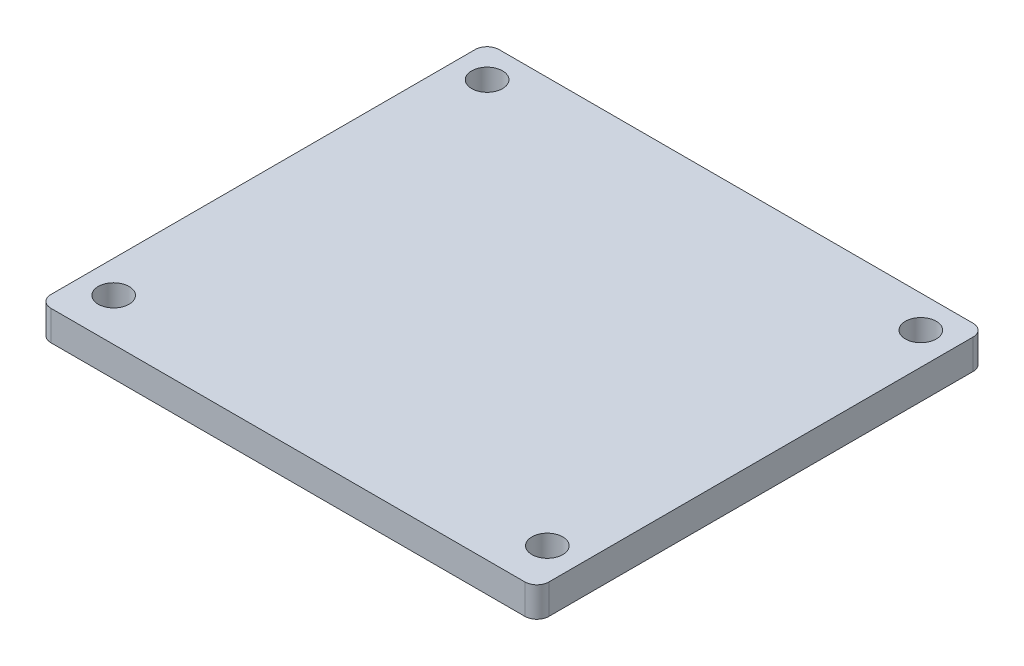
ISO-10303-21;
HEADER;
FILE_DESCRIPTION(('STEP AP214'),'2;1');
FILE_NAME('part.step','',(''),(''),'','','');
FILE_SCHEMA(('AUTOMOTIVE_DESIGN { 1 0 10303 214 1 1 1 1 }'));
ENDSEC;
DATA;
#1=APPLICATION_CONTEXT('core data for automotive mechanical design processes');
#2=APPLICATION_PROTOCOL_DEFINITION('international standard','automotive_design',2000,#1);
#3=PRODUCT_CONTEXT('',#1,'mechanical');
#4=PRODUCT('Part','Part','',(#3));
#5=PRODUCT_RELATED_PRODUCT_CATEGORY('part','',(#4));
#6=PRODUCT_DEFINITION_FORMATION('','',#4);
#7=PRODUCT_DEFINITION_CONTEXT('part definition',#1,'design');
#8=PRODUCT_DEFINITION('design','',#6,#7);
#9=PRODUCT_DEFINITION_SHAPE('','',#8);
#10=(LENGTH_UNIT() NAMED_UNIT(*) SI_UNIT(.MILLI.,.METRE.));
#11=(NAMED_UNIT(*) PLANE_ANGLE_UNIT() SI_UNIT($,.RADIAN.));
#12=(NAMED_UNIT(*) SI_UNIT($,.STERADIAN.) SOLID_ANGLE_UNIT());
#13=UNCERTAINTY_MEASURE_WITH_UNIT(LENGTH_MEASURE(1.E-05),#10,'distance_accuracy_value','');
#14=(GEOMETRIC_REPRESENTATION_CONTEXT(3) GLOBAL_UNCERTAINTY_ASSIGNED_CONTEXT((#13)) GLOBAL_UNIT_ASSIGNED_CONTEXT((#10,
#11,#12)) REPRESENTATION_CONTEXT('',''));
#15=CARTESIAN_POINT('',(0.,0.,0.));
#16=DIRECTION('',(0.,0.,1.));
#17=DIRECTION('',(1.,0.,0.));
#18=AXIS2_PLACEMENT_3D('',#15,#16,#17);
#19=CARTESIAN_POINT('',(-23.8,3.,21.3));
#20=DIRECTION('',(0.,-1.,0.));
#21=DIRECTION('',(0.,0.,-1.));
#22=AXIS2_PLACEMENT_3D('',#19,#20,#21);
#23=PLANE('',#22);
#24=CARTESIAN_POINT('',(-23.8,3.,21.3));
#25=DIRECTION('',(0.,1.,0.));
#26=DIRECTION('',(0.,0.,-1.));
#27=AXIS2_PLACEMENT_3D('',#24,#25,#26);
#28=CIRCLE('',#27,1.2);
#29=CARTESIAN_POINT('',(-25.,3.,21.3));
#30=VERTEX_POINT('',#29);
#31=CARTESIAN_POINT('',(-23.8,3.,22.5));
#32=VERTEX_POINT('',#31);
#33=EDGE_CURVE('E145',#30,#32,#28,.T.);
#34=ORIENTED_EDGE('',*,*,#33,.T.);
#35=DIRECTION('',(1.,0.,0.));
#36=VECTOR('',#35,1.);
#37=CARTESIAN_POINT('',(-23.8,3.,22.5));
#38=LINE('',#37,#36);
#39=CARTESIAN_POINT('',(23.8,3.,22.5));
#40=VERTEX_POINT('',#39);
#41=EDGE_CURVE('E93',#32,#40,#38,.T.);
#42=ORIENTED_EDGE('',*,*,#41,.T.);
#43=CARTESIAN_POINT('',(23.8,3.,21.3));
#44=DIRECTION('',(0.,1.,0.));
#45=DIRECTION('',(0.,0.,1.));
#46=AXIS2_PLACEMENT_3D('',#43,#44,#45);
#47=CIRCLE('',#46,1.2);
#48=CARTESIAN_POINT('',(25.,3.,21.3));
#49=VERTEX_POINT('',#48);
#50=EDGE_CURVE('E160',#40,#49,#47,.T.);
#51=ORIENTED_EDGE('',*,*,#50,.T.);
#52=DIRECTION('',(0.,0.,-1.));
#53=VECTOR('',#52,1.);
#54=CARTESIAN_POINT('',(25.,3.,21.3));
#55=LINE('',#54,#53);
#56=CARTESIAN_POINT('',(25.,3.,-21.3));
#57=VERTEX_POINT('',#56);
#58=EDGE_CURVE('E173',#49,#57,#55,.T.);
#59=ORIENTED_EDGE('',*,*,#58,.T.);
#60=CARTESIAN_POINT('',(23.8,3.,-21.3));
#61=DIRECTION('',(0.,1.,0.));
#62=DIRECTION('',(0.,0.,-1.));
#63=AXIS2_PLACEMENT_3D('',#60,#61,#62);
#64=CIRCLE('',#63,1.2);
#65=CARTESIAN_POINT('',(23.8,3.,-22.5));
#66=VERTEX_POINT('',#65);
#67=EDGE_CURVE('E112',#57,#66,#64,.T.);
#68=ORIENTED_EDGE('',*,*,#67,.T.);
#69=DIRECTION('',(-1.,0.,0.));
#70=VECTOR('',#69,1.);
#71=CARTESIAN_POINT('',(-23.8,3.,-22.5));
#72=LINE('',#71,#70);
#73=CARTESIAN_POINT('',(-23.8,3.,-22.5));
#74=VERTEX_POINT('',#73);
#75=EDGE_CURVE('E106',#66,#74,#72,.T.);
#76=ORIENTED_EDGE('',*,*,#75,.T.);
#77=CARTESIAN_POINT('',(-23.8,3.,-21.3));
#78=DIRECTION('',(0.,1.,0.));
#79=DIRECTION('',(0.,0.,-1.));
#80=AXIS2_PLACEMENT_3D('',#77,#78,#79);
#81=CIRCLE('',#80,1.2);
#82=CARTESIAN_POINT('',(-25.,3.,-21.3));
#83=VERTEX_POINT('',#82);
#84=EDGE_CURVE('E110',#74,#83,#81,.T.);
#85=ORIENTED_EDGE('',*,*,#84,.T.);
#86=DIRECTION('',(0.,0.,1.));
#87=VECTOR('',#86,1.);
#88=CARTESIAN_POINT('',(-25.,3.,21.3));
#89=LINE('',#88,#87);
#90=EDGE_CURVE('E50',#83,#30,#89,.T.);
#91=ORIENTED_EDGE('',*,*,#90,.T.);
#92=EDGE_LOOP('',(#34,#42,#51,#59,#68,#76,#85,#91));
#93=FACE_BOUND('',#92,.T.);
#94=CARTESIAN_POINT('',(-21.775,3.,-19.275));
#95=DIRECTION('',(0.,1.,0.));
#96=DIRECTION('',(0.,0.,1.));
#97=AXIS2_PLACEMENT_3D('',#94,#95,#96);
#98=CIRCLE('',#97,1.55);
#99=CARTESIAN_POINT('',(-21.775,3.,-17.725));
#100=VERTEX_POINT('',#99);
#101=EDGE_CURVE('E134',#100,#100,#98,.T.);
#102=ORIENTED_EDGE('',*,*,#101,.F.);
#103=EDGE_LOOP('',(#102));
#104=FACE_BOUND('',#103,.T.);
#105=CARTESIAN_POINT('',(21.775,3.,-19.275));
#106=DIRECTION('',(0.,1.,0.));
#107=DIRECTION('',(0.,0.,1.));
#108=AXIS2_PLACEMENT_3D('',#105,#106,#107);
#109=CIRCLE('',#108,1.55);
#110=CARTESIAN_POINT('',(21.775,3.,-17.725));
#111=VERTEX_POINT('',#110);
#112=EDGE_CURVE('E182',#111,#111,#109,.T.);
#113=ORIENTED_EDGE('',*,*,#112,.F.);
#114=EDGE_LOOP('',(#113));
#115=FACE_BOUND('',#114,.T.);
#116=CARTESIAN_POINT('',(21.775,3.,18.225));
#117=DIRECTION('',(0.,1.,0.));
#118=DIRECTION('',(0.,0.,1.));
#119=AXIS2_PLACEMENT_3D('',#116,#117,#118);
#120=CIRCLE('',#119,1.55);
#121=CARTESIAN_POINT('',(21.775,3.,19.775));
#122=VERTEX_POINT('',#121);
#123=EDGE_CURVE('E188',#122,#122,#120,.T.);
#124=ORIENTED_EDGE('',*,*,#123,.F.);
#125=EDGE_LOOP('',(#124));
#126=FACE_BOUND('',#125,.T.);
#127=CARTESIAN_POINT('',(-21.775,3.,18.225));
#128=DIRECTION('',(0.,1.,0.));
#129=DIRECTION('',(0.,0.,1.));
#130=AXIS2_PLACEMENT_3D('',#127,#128,#129);
#131=CIRCLE('',#130,1.55);
#132=CARTESIAN_POINT('',(-21.775,3.,19.775));
#133=VERTEX_POINT('',#132);
#134=EDGE_CURVE('E194',#133,#133,#131,.T.);
#135=ORIENTED_EDGE('',*,*,#134,.F.);
#136=EDGE_LOOP('',(#135));
#137=FACE_BOUND('',#136,.T.);
#138=ADVANCED_FACE('F33',(#93,#104,#115,#126,#137),#23,.F.);
#139=CARTESIAN_POINT('',(-23.8,0.,21.3));
#140=DIRECTION('',(0.,-1.,0.));
#141=DIRECTION('',(0.,0.,-1.));
#142=AXIS2_PLACEMENT_3D('',#139,#140,#141);
#143=PLANE('',#142);
#144=CARTESIAN_POINT('',(21.775,0.,18.225));
#145=DIRECTION('',(0.,1.,0.));
#146=DIRECTION('',(0.,0.,1.));
#147=AXIS2_PLACEMENT_3D('',#144,#145,#146);
#148=CIRCLE('',#147,1.55);
#149=CARTESIAN_POINT('',(21.775,0.,19.775));
#150=VERTEX_POINT('',#149);
#151=EDGE_CURVE('E191',#150,#150,#148,.T.);
#152=ORIENTED_EDGE('',*,*,#151,.T.);
#153=EDGE_LOOP('',(#152));
#154=FACE_BOUND('',#153,.T.);
#155=CARTESIAN_POINT('',(-21.775,0.,-19.275));
#156=DIRECTION('',(0.,1.,0.));
#157=DIRECTION('',(0.,0.,1.));
#158=AXIS2_PLACEMENT_3D('',#155,#156,#157);
#159=CIRCLE('',#158,1.55);
#160=CARTESIAN_POINT('',(-21.775,0.,-17.725));
#161=VERTEX_POINT('',#160);
#162=EDGE_CURVE('E179',#161,#161,#159,.T.);
#163=ORIENTED_EDGE('',*,*,#162,.T.);
#164=EDGE_LOOP('',(#163));
#165=FACE_BOUND('',#164,.T.);
#166=CARTESIAN_POINT('',(-23.8,0.,21.3));
#167=DIRECTION('',(0.,1.,0.));
#168=DIRECTION('',(0.,0.,-1.));
#169=AXIS2_PLACEMENT_3D('',#166,#167,#168);
#170=CIRCLE('',#169,1.2);
#171=CARTESIAN_POINT('',(-25.,0.,21.3));
#172=VERTEX_POINT('',#171);
#173=CARTESIAN_POINT('',(-23.8,0.,22.5));
#174=VERTEX_POINT('',#173);
#175=EDGE_CURVE('E130',#172,#174,#170,.T.);
#176=ORIENTED_EDGE('',*,*,#175,.F.);
#177=DIRECTION('',(0.,0.,1.));
#178=VECTOR('',#177,1.);
#179=CARTESIAN_POINT('',(-25.,0.,21.3));
#180=LINE('',#179,#178);
#181=CARTESIAN_POINT('',(-25.,0.,-21.3));
#182=VERTEX_POINT('',#181);
#183=EDGE_CURVE('E85',#182,#172,#180,.T.);
#184=ORIENTED_EDGE('',*,*,#183,.F.);
#185=CARTESIAN_POINT('',(-23.8,0.,-21.3));
#186=DIRECTION('',(0.,1.,0.));
#187=DIRECTION('',(0.,0.,-1.));
#188=AXIS2_PLACEMENT_3D('',#185,#186,#187);
#189=CIRCLE('',#188,1.2);
#190=CARTESIAN_POINT('',(-23.8,0.,-22.5));
#191=VERTEX_POINT('',#190);
#192=EDGE_CURVE('E79',#191,#182,#189,.T.);
#193=ORIENTED_EDGE('',*,*,#192,.F.);
#194=DIRECTION('',(-1.,0.,0.));
#195=VECTOR('',#194,1.);
#196=CARTESIAN_POINT('',(-23.8,0.,-22.5));
#197=LINE('',#196,#195);
#198=CARTESIAN_POINT('',(23.8,0.,-22.5));
#199=VERTEX_POINT('',#198);
#200=EDGE_CURVE('E120',#199,#191,#197,.T.);
#201=ORIENTED_EDGE('',*,*,#200,.F.);
#202=CARTESIAN_POINT('',(23.8,0.,-21.3));
#203=DIRECTION('',(0.,1.,0.));
#204=DIRECTION('',(0.,0.,-1.));
#205=AXIS2_PLACEMENT_3D('',#202,#203,#204);
#206=CIRCLE('',#205,1.2);
#207=CARTESIAN_POINT('',(25.,0.,-21.3));
#208=VERTEX_POINT('',#207);
#209=EDGE_CURVE('E140',#208,#199,#206,.T.);
#210=ORIENTED_EDGE('',*,*,#209,.F.);
#211=DIRECTION('',(0.,0.,-1.));
#212=VECTOR('',#211,1.);
#213=CARTESIAN_POINT('',(25.,0.,21.3));
#214=LINE('',#213,#212);
#215=CARTESIAN_POINT('',(25.,0.,21.3));
#216=VERTEX_POINT('',#215);
#217=EDGE_CURVE('E138',#216,#208,#214,.T.);
#218=ORIENTED_EDGE('',*,*,#217,.F.);
#219=CARTESIAN_POINT('',(23.8,0.,21.3));
#220=DIRECTION('',(0.,1.,0.));
#221=DIRECTION('',(0.,0.,1.));
#222=AXIS2_PLACEMENT_3D('',#219,#220,#221);
#223=CIRCLE('',#222,1.2);
#224=CARTESIAN_POINT('',(23.8,0.,22.5));
#225=VERTEX_POINT('',#224);
#226=EDGE_CURVE('E136',#225,#216,#223,.T.);
#227=ORIENTED_EDGE('',*,*,#226,.F.);
#228=DIRECTION('',(1.,0.,0.));
#229=VECTOR('',#228,1.);
#230=CARTESIAN_POINT('',(-23.8,0.,22.5));
#231=LINE('',#230,#229);
#232=EDGE_CURVE('E133',#174,#225,#231,.T.);
#233=ORIENTED_EDGE('',*,*,#232,.F.);
#234=EDGE_LOOP('',(#176,#184,#193,#201,#210,#218,#227,#233));
#235=FACE_BOUND('',#234,.T.);
#236=CARTESIAN_POINT('',(21.775,0.,-19.275));
#237=DIRECTION('',(0.,1.,0.));
#238=DIRECTION('',(0.,0.,1.));
#239=AXIS2_PLACEMENT_3D('',#236,#237,#238);
#240=CIRCLE('',#239,1.55);
#241=CARTESIAN_POINT('',(21.775,0.,-17.725));
#242=VERTEX_POINT('',#241);
#243=EDGE_CURVE('E185',#242,#242,#240,.T.);
#244=ORIENTED_EDGE('',*,*,#243,.T.);
#245=EDGE_LOOP('',(#244));
#246=FACE_BOUND('',#245,.T.);
#247=CARTESIAN_POINT('',(-21.775,0.,18.225));
#248=DIRECTION('',(0.,1.,0.));
#249=DIRECTION('',(0.,0.,1.));
#250=AXIS2_PLACEMENT_3D('',#247,#248,#249);
#251=CIRCLE('',#250,1.55);
#252=CARTESIAN_POINT('',(-21.775,0.,19.775));
#253=VERTEX_POINT('',#252);
#254=EDGE_CURVE('E197',#253,#253,#251,.T.);
#255=ORIENTED_EDGE('',*,*,#254,.T.);
#256=EDGE_LOOP('',(#255));
#257=FACE_BOUND('',#256,.T.);
#258=ADVANCED_FACE('F164',(#154,#165,#235,#246,#257),#143,.T.);
#259=CARTESIAN_POINT('',(-23.8,3.,21.3));
#260=DIRECTION('',(0.,-1.,0.));
#261=DIRECTION('',(0.,0.,-1.));
#262=AXIS2_PLACEMENT_3D('',#259,#260,#261);
#263=CYLINDRICAL_SURFACE('',#262,1.2);
#264=ORIENTED_EDGE('',*,*,#175,.T.);
#265=DIRECTION('',(0.,-1.,0.));
#266=VECTOR('',#265,1.);
#267=CARTESIAN_POINT('',(-23.8,3.,22.5));
#268=LINE('',#267,#266);
#269=EDGE_CURVE('E11',#32,#174,#268,.T.);
#270=ORIENTED_EDGE('',*,*,#269,.F.);
#271=ORIENTED_EDGE('',*,*,#33,.F.);
#272=DIRECTION('',(0.,-1.,0.));
#273=VECTOR('',#272,1.);
#274=CARTESIAN_POINT('',(-25.,3.,21.3));
#275=LINE('',#274,#273);
#276=EDGE_CURVE('E126',#30,#172,#275,.T.);
#277=ORIENTED_EDGE('',*,*,#276,.T.);
#278=EDGE_LOOP('',(#264,#270,#271,#277));
#279=FACE_BOUND('',#278,.T.);
#280=ADVANCED_FACE('F35',(#279),#263,.T.);
#281=CARTESIAN_POINT('',(-23.8,3.,22.5));
#282=DIRECTION('',(0.,0.,-1.));
#283=DIRECTION('',(-1.,0.,0.));
#284=AXIS2_PLACEMENT_3D('',#281,#282,#283);
#285=PLANE('',#284);
#286=ORIENTED_EDGE('',*,*,#232,.T.);
#287=DIRECTION('',(0.,-1.,0.));
#288=VECTOR('',#287,1.);
#289=CARTESIAN_POINT('',(23.8,3.,22.5));
#290=LINE('',#289,#288);
#291=EDGE_CURVE('E42',#40,#225,#290,.T.);
#292=ORIENTED_EDGE('',*,*,#291,.F.);
#293=ORIENTED_EDGE('',*,*,#41,.F.);
#294=ORIENTED_EDGE('',*,*,#269,.T.);
#295=EDGE_LOOP('',(#286,#292,#293,#294));
#296=FACE_BOUND('',#295,.T.);
#297=ADVANCED_FACE('F229',(#296),#285,.F.);
#298=CARTESIAN_POINT('',(23.8,3.,21.3));
#299=DIRECTION('',(0.,-1.,0.));
#300=DIRECTION('',(0.,0.,-1.));
#301=AXIS2_PLACEMENT_3D('',#298,#299,#300);
#302=CYLINDRICAL_SURFACE('',#301,1.2);
#303=ORIENTED_EDGE('',*,*,#226,.T.);
#304=DIRECTION('',(0.,-1.,0.));
#305=VECTOR('',#304,1.);
#306=CARTESIAN_POINT('',(25.,3.,21.3));
#307=LINE('',#306,#305);
#308=EDGE_CURVE('E152',#49,#216,#307,.T.);
#309=ORIENTED_EDGE('',*,*,#308,.F.);
#310=ORIENTED_EDGE('',*,*,#50,.F.);
#311=ORIENTED_EDGE('',*,*,#291,.T.);
#312=EDGE_LOOP('',(#303,#309,#310,#311));
#313=FACE_BOUND('',#312,.T.);
#314=ADVANCED_FACE('F158',(#313),#302,.T.);
#315=CARTESIAN_POINT('',(25.,3.,21.3));
#316=DIRECTION('',(-1.,0.,0.));
#317=DIRECTION('',(0.,0.,1.));
#318=AXIS2_PLACEMENT_3D('',#315,#316,#317);
#319=PLANE('',#318);
#320=ORIENTED_EDGE('',*,*,#217,.T.);
#321=DIRECTION('',(0.,-1.,0.));
#322=VECTOR('',#321,1.);
#323=CARTESIAN_POINT('',(25.,3.,-21.3));
#324=LINE('',#323,#322);
#325=EDGE_CURVE('E149',#57,#208,#324,.T.);
#326=ORIENTED_EDGE('',*,*,#325,.F.);
#327=ORIENTED_EDGE('',*,*,#58,.F.);
#328=ORIENTED_EDGE('',*,*,#308,.T.);
#329=EDGE_LOOP('',(#320,#326,#327,#328));
#330=FACE_BOUND('',#329,.T.);
#331=ADVANCED_FACE('F169',(#330),#319,.F.);
#332=CARTESIAN_POINT('',(23.8,3.,-21.3));
#333=DIRECTION('',(0.,-1.,0.));
#334=DIRECTION('',(0.,0.,-1.));
#335=AXIS2_PLACEMENT_3D('',#332,#333,#334);
#336=CYLINDRICAL_SURFACE('',#335,1.2);
#337=ORIENTED_EDGE('',*,*,#209,.T.);
#338=DIRECTION('',(0.,-1.,0.));
#339=VECTOR('',#338,1.);
#340=CARTESIAN_POINT('',(23.8,3.,-22.5));
#341=LINE('',#340,#339);
#342=EDGE_CURVE('E121',#66,#199,#341,.T.);
#343=ORIENTED_EDGE('',*,*,#342,.F.);
#344=ORIENTED_EDGE('',*,*,#67,.F.);
#345=ORIENTED_EDGE('',*,*,#325,.T.);
#346=EDGE_LOOP('',(#337,#343,#344,#345));
#347=FACE_BOUND('',#346,.T.);
#348=ADVANCED_FACE('F172',(#347),#336,.T.);
#349=CARTESIAN_POINT('',(-23.8,3.,-22.5));
#350=DIRECTION('',(0.,0.,1.));
#351=DIRECTION('',(1.,0.,0.));
#352=AXIS2_PLACEMENT_3D('',#349,#350,#351);
#353=PLANE('',#352);
#354=ORIENTED_EDGE('',*,*,#200,.T.);
#355=DIRECTION('',(0.,-1.,0.));
#356=VECTOR('',#355,1.);
#357=CARTESIAN_POINT('',(-23.8,3.,-22.5));
#358=LINE('',#357,#356);
#359=EDGE_CURVE('E117',#74,#191,#358,.T.);
#360=ORIENTED_EDGE('',*,*,#359,.F.);
#361=ORIENTED_EDGE('',*,*,#75,.F.);
#362=ORIENTED_EDGE('',*,*,#342,.T.);
#363=EDGE_LOOP('',(#354,#360,#361,#362));
#364=FACE_BOUND('',#363,.T.);
#365=ADVANCED_FACE('F118',(#364),#353,.F.);
#366=CARTESIAN_POINT('',(-23.8,3.,-21.3));
#367=DIRECTION('',(0.,-1.,0.));
#368=DIRECTION('',(0.,0.,-1.));
#369=AXIS2_PLACEMENT_3D('',#366,#367,#368);
#370=CYLINDRICAL_SURFACE('',#369,1.2);
#371=ORIENTED_EDGE('',*,*,#192,.T.);
#372=DIRECTION('',(0.,-1.,0.));
#373=VECTOR('',#372,1.);
#374=CARTESIAN_POINT('',(-25.,3.,-21.3));
#375=LINE('',#374,#373);
#376=EDGE_CURVE('E122',#83,#182,#375,.T.);
#377=ORIENTED_EDGE('',*,*,#376,.F.);
#378=ORIENTED_EDGE('',*,*,#84,.F.);
#379=ORIENTED_EDGE('',*,*,#359,.T.);
#380=EDGE_LOOP('',(#371,#377,#378,#379));
#381=FACE_BOUND('',#380,.T.);
#382=ADVANCED_FACE('F124',(#381),#370,.T.);
#383=CARTESIAN_POINT('',(-25.,3.,21.3));
#384=DIRECTION('',(1.,0.,0.));
#385=DIRECTION('',(0.,0.,-1.));
#386=AXIS2_PLACEMENT_3D('',#383,#384,#385);
#387=PLANE('',#386);
#388=ORIENTED_EDGE('',*,*,#183,.T.);
#389=ORIENTED_EDGE('',*,*,#276,.F.);
#390=ORIENTED_EDGE('',*,*,#90,.F.);
#391=ORIENTED_EDGE('',*,*,#376,.T.);
#392=EDGE_LOOP('',(#388,#389,#390,#391));
#393=FACE_BOUND('',#392,.T.);
#394=ADVANCED_FACE('F217',(#393),#387,.F.);
#395=CARTESIAN_POINT('',(-21.775,3.,-19.275));
#396=DIRECTION('',(0.,-1.,0.));
#397=DIRECTION('',(0.,0.,-1.));
#398=AXIS2_PLACEMENT_3D('',#395,#396,#397);
#399=CYLINDRICAL_SURFACE('',#398,1.55);
#400=ORIENTED_EDGE('',*,*,#101,.T.);
#401=EDGE_LOOP('',(#400));
#402=FACE_BOUND('',#401,.T.);
#403=ORIENTED_EDGE('',*,*,#162,.F.);
#404=EDGE_LOOP('',(#403));
#405=FACE_BOUND('',#404,.T.);
#406=ADVANCED_FACE('F214',(#402,#405),#399,.F.);
#407=CARTESIAN_POINT('',(21.775,3.,-19.275));
#408=DIRECTION('',(0.,-1.,0.));
#409=DIRECTION('',(0.,0.,-1.));
#410=AXIS2_PLACEMENT_3D('',#407,#408,#409);
#411=CYLINDRICAL_SURFACE('',#410,1.55);
#412=ORIENTED_EDGE('',*,*,#112,.T.);
#413=EDGE_LOOP('',(#412));
#414=FACE_BOUND('',#413,.T.);
#415=ORIENTED_EDGE('',*,*,#243,.F.);
#416=EDGE_LOOP('',(#415));
#417=FACE_BOUND('',#416,.T.);
#418=ADVANCED_FACE('F293',(#414,#417),#411,.F.);
#419=CARTESIAN_POINT('',(21.775,3.,18.225));
#420=DIRECTION('',(0.,-1.,0.));
#421=DIRECTION('',(0.,0.,-1.));
#422=AXIS2_PLACEMENT_3D('',#419,#420,#421);
#423=CYLINDRICAL_SURFACE('',#422,1.55);
#424=ORIENTED_EDGE('',*,*,#123,.T.);
#425=EDGE_LOOP('',(#424));
#426=FACE_BOUND('',#425,.T.);
#427=ORIENTED_EDGE('',*,*,#151,.F.);
#428=EDGE_LOOP('',(#427));
#429=FACE_BOUND('',#428,.T.);
#430=ADVANCED_FACE('F301',(#426,#429),#423,.F.);
#431=CARTESIAN_POINT('',(-21.775,3.,18.225));
#432=DIRECTION('',(0.,-1.,0.));
#433=DIRECTION('',(0.,0.,-1.));
#434=AXIS2_PLACEMENT_3D('',#431,#432,#433);
#435=CYLINDRICAL_SURFACE('',#434,1.55);
#436=ORIENTED_EDGE('',*,*,#134,.T.);
#437=EDGE_LOOP('',(#436));
#438=FACE_BOUND('',#437,.T.);
#439=ORIENTED_EDGE('',*,*,#254,.F.);
#440=EDGE_LOOP('',(#439));
#441=FACE_BOUND('',#440,.T.);
#442=ADVANCED_FACE('F203',(#438,#441),#435,.F.);
#443=CLOSED_SHELL('',(#138,#258,#280,#297,#314,#331,#348,#365,#382,#394,#406,#418,#430,#442));
#444=MANIFOLD_SOLID_BREP('B2',#443);
#445=ADVANCED_BREP_SHAPE_REPRESENTATION('',(#18,#444),#14);
#446=SHAPE_DEFINITION_REPRESENTATION(#9,#445);
ENDSEC;
END-ISO-10303-21;
